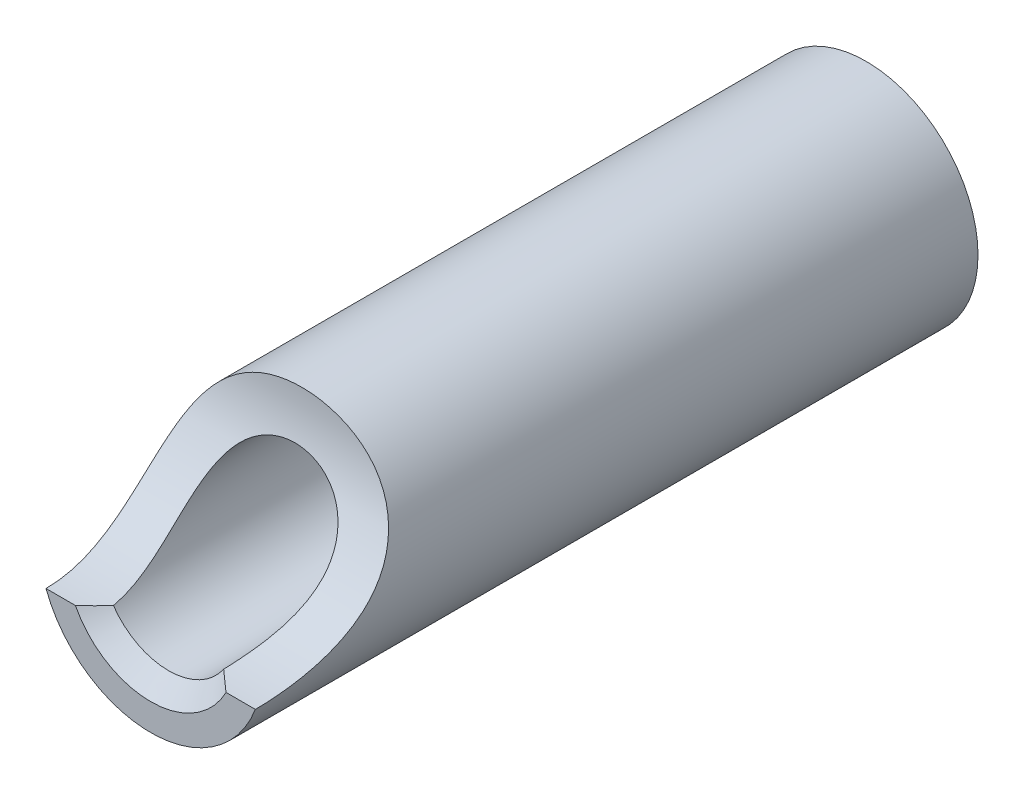
ISO-10303-21;
HEADER;
FILE_DESCRIPTION(('STEP AP214'),'2;1');
FILE_NAME('part.step','',(''),(''),'','','');
FILE_SCHEMA(('AUTOMOTIVE_DESIGN { 1 0 10303 214 1 1 1 1 }'));
ENDSEC;
DATA;
#1=APPLICATION_CONTEXT('core data for automotive mechanical design processes');
#2=APPLICATION_PROTOCOL_DEFINITION('international standard','automotive_design',2000,#1);
#3=PRODUCT_CONTEXT('',#1,'mechanical');
#4=PRODUCT('Part','Part','',(#3));
#5=PRODUCT_RELATED_PRODUCT_CATEGORY('part','',(#4));
#6=PRODUCT_DEFINITION_FORMATION('','',#4);
#7=PRODUCT_DEFINITION_CONTEXT('part definition',#1,'design');
#8=PRODUCT_DEFINITION('design','',#6,#7);
#9=PRODUCT_DEFINITION_SHAPE('','',#8);
#10=(LENGTH_UNIT() NAMED_UNIT(*) SI_UNIT(.MILLI.,.METRE.));
#11=(NAMED_UNIT(*) PLANE_ANGLE_UNIT() SI_UNIT($,.RADIAN.));
#12=(NAMED_UNIT(*) SI_UNIT($,.STERADIAN.) SOLID_ANGLE_UNIT());
#13=UNCERTAINTY_MEASURE_WITH_UNIT(LENGTH_MEASURE(1.E-05),#10,'distance_accuracy_value','');
#14=(GEOMETRIC_REPRESENTATION_CONTEXT(3) GLOBAL_UNCERTAINTY_ASSIGNED_CONTEXT((#13)) GLOBAL_UNIT_ASSIGNED_CONTEXT((#10,
#11,#12)) REPRESENTATION_CONTEXT('',''));
#15=CARTESIAN_POINT('',(0.,0.,0.));
#16=DIRECTION('',(0.,0.,1.));
#17=DIRECTION('',(1.,0.,0.));
#18=AXIS2_PLACEMENT_3D('',#15,#16,#17);
#19=CARTESIAN_POINT('',(0.,0.,50.8));
#20=DIRECTION('',(0.,0.,1.));
#21=DIRECTION('',(1.,0.,0.));
#22=AXIS2_PLACEMENT_3D('',#19,#20,#21);
#23=PLANE('',#22);
#24=DIRECTION('',(1.,0.,0.));
#25=VECTOR('',#24,1.);
#26=CARTESIAN_POINT('',(-7.9375,-2.78989828210711,50.8));
#27=LINE('',#26,#25);
#28=CARTESIAN_POINT('',(-7.43104123427503,-2.78989828210711,50.8));
#29=VERTEX_POINT('',#28);
#30=CARTESIAN_POINT('',(-5.34860017439103,-2.78989828210711,50.8));
#31=VERTEX_POINT('',#30);
#32=EDGE_CURVE('E95',#29,#31,#27,.T.);
#33=ORIENTED_EDGE('',*,*,#32,.F.);
#34=CARTESIAN_POINT('',(0.,0.,50.8));
#35=DIRECTION('',(0.,0.,1.));
#36=DIRECTION('',(1.,0.,0.));
#37=AXIS2_PLACEMENT_3D('',#34,#35,#36);
#38=CIRCLE('',#37,7.9375);
#39=CARTESIAN_POINT('',(7.43104123427503,-2.78989828210711,50.8));
#40=VERTEX_POINT('',#39);
#41=EDGE_CURVE('E89',#29,#40,#38,.T.);
#42=ORIENTED_EDGE('',*,*,#41,.T.);
#43=CARTESIAN_POINT('',(5.34860017439103,-2.78989828210711,50.8));
#44=VERTEX_POINT('',#43);
#45=EDGE_CURVE('E77',#44,#40,#27,.T.);
#46=ORIENTED_EDGE('',*,*,#45,.F.);
#47=CARTESIAN_POINT('',(0.,0.,50.8));
#48=DIRECTION('',(0.,0.,1.));
#49=DIRECTION('',(1.,0.,0.));
#50=AXIS2_PLACEMENT_3D('',#47,#48,#49);
#51=CIRCLE('',#50,6.0325);
#52=EDGE_CURVE('E88',#44,#31,#51,.F.);
#53=ORIENTED_EDGE('',*,*,#52,.T.);
#54=EDGE_LOOP('',(#33,#42,#46,#53));
#55=FACE_BOUND('',#54,.T.);
#56=ADVANCED_FACE('F41',(#55),#23,.T.);
#57=CARTESIAN_POINT('',(0.,0.,0.));
#58=DIRECTION('',(0.,0.,1.));
#59=DIRECTION('',(1.,0.,0.));
#60=AXIS2_PLACEMENT_3D('',#57,#58,#59);
#61=PLANE('',#60);
#62=CARTESIAN_POINT('',(0.,0.,0.));
#63=DIRECTION('',(0.,0.,1.));
#64=DIRECTION('',(1.,0.,0.));
#65=AXIS2_PLACEMENT_3D('',#62,#63,#64);
#66=CIRCLE('',#65,6.03249999999999);
#67=CARTESIAN_POINT('',(6.03249999999999,0.,0.));
#68=VERTEX_POINT('',#67);
#69=EDGE_CURVE('E154',#68,#68,#66,.T.);
#70=ORIENTED_EDGE('',*,*,#69,.T.);
#71=EDGE_LOOP('',(#70));
#72=FACE_BOUND('',#71,.T.);
#73=CARTESIAN_POINT('',(0.,0.,0.));
#74=DIRECTION('',(0.,0.,1.));
#75=DIRECTION('',(1.,0.,0.));
#76=AXIS2_PLACEMENT_3D('',#73,#74,#75);
#77=CIRCLE('',#76,7.9375);
#78=CARTESIAN_POINT('',(7.9375,0.,0.));
#79=VERTEX_POINT('',#78);
#80=EDGE_CURVE('E158',#79,#79,#77,.T.);
#81=ORIENTED_EDGE('',*,*,#80,.F.);
#82=EDGE_LOOP('',(#81));
#83=FACE_BOUND('',#82,.T.);
#84=ADVANCED_FACE('F128',(#72,#83),#61,.F.);
#85=CARTESIAN_POINT('',(0.,0.,50.8));
#86=DIRECTION('',(0.,0.,-1.));
#87=DIRECTION('',(-1.,0.,0.));
#88=AXIS2_PLACEMENT_3D('',#85,#86,#87);
#89=CYLINDRICAL_SURFACE('',#88,7.9375);
#90=ORIENTED_EDGE('',*,*,#41,.F.);
#91=CARTESIAN_POINT('',(-7.43104123427503,-2.78989828210711,50.8));
#92=CARTESIAN_POINT('',(-7.43102382136732,-2.78990287666445,50.6300305804789));
#93=CARTESIAN_POINT('',(-7.43255743304067,-2.78585876748104,50.4600656508634));
#94=CARTESIAN_POINT('',(-7.43859906079418,-2.76970866942878,50.1205840915058));
#95=CARTESIAN_POINT('',(-7.44310686184932,-2.7576032633671,49.9510674302446));
#96=CARTESIAN_POINT('',(-7.45496526672832,-2.72537693640078,49.613010811213));
#97=CARTESIAN_POINT('',(-7.46231395553059,-2.70526141478227,49.4444702729597));
#98=CARTESIAN_POINT('',(-7.47960163144594,-2.65708728652565,49.1086763089797));
#99=CARTESIAN_POINT('',(-7.48954064590534,-2.62902859603045,48.9414228968606));
#100=CARTESIAN_POINT('',(-7.52275189989414,-2.5331339163702,48.4425864015902));
#101=CARTESIAN_POINT('',(-7.54943806174162,-2.45353013550547,48.1134136834843));
#102=CARTESIAN_POINT('',(-7.60848021569662,-2.2637930983823,47.464583373558));
#103=CARTESIAN_POINT('',(-7.64083629896272,-2.15365935125944,47.1449259348169));
#104=CARTESIAN_POINT('',(-7.70233574094531,-1.92102106878398,46.5607278169839));
#105=CARTESIAN_POINT('',(-7.73130869441506,-1.80230290366631,46.2946545453673));
#106=CARTESIAN_POINT('',(-7.78710240029921,-1.54352167511713,45.7728642390489));
#107=CARTESIAN_POINT('',(-7.8139232976753,-1.40346005121877,45.5171465073774));
#108=CARTESIAN_POINT('',(-7.86197518912549,-1.10289819712657,45.0178652563709));
#109=CARTESIAN_POINT('',(-7.88321278062526,-0.942422424901867,44.7742876702836));
#110=CARTESIAN_POINT('',(-7.91650004182506,-0.601824881937868,44.3006127732499));
#111=CARTESIAN_POINT('',(-7.92855177653041,-0.421707537090205,44.0705124433235));
#112=CARTESIAN_POINT('',(-7.93844280788201,-0.084044057264312,43.6736857820491));
#113=CARTESIAN_POINT('',(-7.93879033193087,0.0699700601929678,43.5040087357604));
#114=CARTESIAN_POINT('',(-7.92959105876708,0.388393387492886,43.1750123071314));
#115=CARTESIAN_POINT('',(-7.92004652518047,0.5528002110625,43.0156905640233));
#116=CARTESIAN_POINT('',(-7.88918254279768,0.890772215138729,42.7084726447517));
#117=CARTESIAN_POINT('',(-7.86787031604665,1.06433171944766,42.5605695241686));
#118=CARTESIAN_POINT('',(-7.81166336377182,1.41918364925817,42.2770787619046));
#119=CARTESIAN_POINT('',(-7.7767684837153,1.60047616271895,42.1414912603627));
#120=CARTESIAN_POINT('',(-7.69137320831778,1.97054895184782,41.8823743048738));
#121=CARTESIAN_POINT('',(-7.64073281411452,2.1593825984532,41.7589666599726));
#122=CARTESIAN_POINT('',(-7.52258766260895,2.54054688233775,41.5263918064629));
#123=CARTESIAN_POINT('',(-7.45508285568243,2.73287752990545,41.4172246397589));
#124=CARTESIAN_POINT('',(-7.30232516710918,3.11815088145521,41.2136349154753));
#125=CARTESIAN_POINT('',(-7.2170826963214,3.31109316132285,41.11920376545));
#126=CARTESIAN_POINT('',(-7.0284235603619,3.69470276080392,40.9450465779261));
#127=CARTESIAN_POINT('',(-6.92500944724275,3.88537039586169,40.8653184787273));
#128=CARTESIAN_POINT('',(-6.71620937883633,4.23458896601063,40.7304706130676));
#129=CARTESIAN_POINT('',(-6.61320592477682,4.39384368274212,40.6734630445075));
#130=CARTESIAN_POINT('',(-6.3943568302916,4.7066473026656,40.5693681143987));
#131=CARTESIAN_POINT('',(-6.27851259412107,4.86019682732437,40.5222796697347));
#132=CARTESIAN_POINT('',(-6.03458466691356,5.15994592825254,40.4372517730344));
#133=CARTESIAN_POINT('',(-5.90649959355786,5.30614467156994,40.3993133559901));
#134=CARTESIAN_POINT('',(-5.63889137830772,5.58970647953128,40.3316576211885));
#135=CARTESIAN_POINT('',(-5.49936783446307,5.72706923337377,40.3019405924931));
#136=CARTESIAN_POINT('',(-5.21155080996345,5.9900913555497,40.2500032139038));
#137=CARTESIAN_POINT('',(-5.06338337455723,6.1158718791936,40.2276967834758));
#138=CARTESIAN_POINT('',(-4.7576708045974,6.35659859858504,40.1890294262914));
#139=CARTESIAN_POINT('',(-4.60012174634901,6.47154020848765,40.1726710077992));
#140=CARTESIAN_POINT('',(-4.27669673071728,6.68968005124859,40.1448550946417));
#141=CARTESIAN_POINT('',(-4.11082101241473,6.79287862100354,40.1333974593516));
#142=CARTESIAN_POINT('',(-3.77173904915526,6.98684822231555,40.1143631729308));
#143=CARTESIAN_POINT('',(-3.59853233984044,7.07761846509363,40.1067867680437));
#144=CARTESIAN_POINT('',(-3.23118121890754,7.25314911320936,40.0940615628894));
#145=CARTESIAN_POINT('',(-3.03649126155879,7.33678791981515,40.0891660044906));
#146=CARTESIAN_POINT('',(-2.64100671426011,7.48824637138037,40.0817447095968));
#147=CARTESIAN_POINT('',(-2.44021184398751,7.5560652886854,40.0792190820934));
#148=CARTESIAN_POINT('',(-2.03379159582999,7.67544541188357,40.0756365459336));
#149=CARTESIAN_POINT('',(-1.82816530449564,7.72700351642451,40.0745799173221));
#150=CARTESIAN_POINT('',(-1.41344593813608,7.81351068200985,40.073231036787));
#151=CARTESIAN_POINT('',(-1.20435280924588,7.84845948474122,40.0729387967512));
#152=CARTESIAN_POINT('',(-0.773924495256755,7.90279910859216,40.0726214288197));
#153=CARTESIAN_POINT('',(-0.55248417020049,7.92136086992471,40.0726098230092));
#154=CARTESIAN_POINT('',(-0.108821911205786,7.93985911048411,40.0725980380658));
#155=CARTESIAN_POINT('',(0.113400050017452,7.93979493294639,40.0725978593359));
#156=CARTESIAN_POINT('',(0.557081925983102,7.92103981558556,40.0726102526628));
#157=CARTESIAN_POINT('',(0.778541754002242,7.90234682201283,40.0726228261255));
#158=CARTESIAN_POINT('',(1.21911362131316,7.84646259335156,40.0729517201595));
#159=CARTESIAN_POINT('',(1.43822566935034,7.8092714271926,40.073268039599));
#160=CARTESIAN_POINT('',(1.87366608047325,7.71641694102895,40.0747792047649));
#161=CARTESIAN_POINT('',(2.08997458429771,7.66066051250474,40.0759785163561));
#162=CARTESIAN_POINT('',(2.51711441224049,7.53112529358036,40.0801059368539));
#163=CARTESIAN_POINT('',(2.72794567078238,7.45734628751446,40.0830340664489));
#164=CARTESIAN_POINT('',(3.14263237186589,7.29229568937398,40.0917036258467));
#165=CARTESIAN_POINT('',(3.34648664098042,7.20102117168457,40.097445526421));
#166=CARTESIAN_POINT('',(3.74566174434047,7.00169181846985,40.1130301270691));
#167=CARTESIAN_POINT('',(3.9409826969583,6.89363721580899,40.1228727702384));
#168=CARTESIAN_POINT('',(4.31977867449776,6.66274324086284,40.1479851845992));
#169=CARTESIAN_POINT('',(4.50334850550061,6.54005386370649,40.163202580503));
#170=CARTESIAN_POINT('',(4.85919245243613,6.28018216418937,40.2005851233279));
#171=CARTESIAN_POINT('',(5.03146656754056,6.14299984076593,40.2227502707584));
#172=CARTESIAN_POINT('',(5.36319971911526,5.85560582055087,40.2755468935885));
#173=CARTESIAN_POINT('',(5.5226673083275,5.70540296119538,40.3061726569089));
#174=CARTESIAN_POINT('',(5.82759466033357,5.39356898422031,40.3773780353624));
#175=CARTESIAN_POINT('',(5.97305561285844,5.23193883926645,40.4179568040415));
#176=CARTESIAN_POINT('',(6.23961577527605,4.91037300546002,40.5073070286199));
#177=CARTESIAN_POINT('',(6.3616932561422,4.75104531198242,40.5553501732749));
#178=CARTESIAN_POINT('',(6.59193554411299,4.42605259019641,40.6621474508343));
#179=CARTESIAN_POINT('',(6.70010107495998,4.26038789214064,40.7209010261645));
#180=CARTESIAN_POINT('',(6.90201911734241,3.92483973314183,40.8497281288322));
#181=CARTESIAN_POINT('',(6.99577772128369,3.75495809095937,40.9197968453671));
#182=CARTESIAN_POINT('',(7.16879845948029,3.41305464766019,41.0716165547509));
#183=CARTESIAN_POINT('',(7.24806105230723,3.24103291442775,41.1533671779047));
#184=CARTESIAN_POINT('',(7.38750399675042,2.90843964275421,41.3227583474116));
#185=CARTESIAN_POINT('',(7.44860289189289,2.7478675146072,41.4096455086561));
#186=CARTESIAN_POINT('',(7.5587995738205,2.42837593338201,41.5934487311609));
#187=CARTESIAN_POINT('',(7.60789800040874,2.26945639262911,41.6903642573683));
#188=CARTESIAN_POINT('',(7.6947777365213,1.95472877078506,41.8938979209602));
#189=CARTESIAN_POINT('',(7.73255628093448,1.79892145857967,42.0005184207027));
#190=CARTESIAN_POINT('',(7.7976405784127,1.4917639580717,42.2229651827356));
#191=CARTESIAN_POINT('',(7.82494575352329,1.34041401616661,42.3387919526322));
#192=CARTESIAN_POINT('',(7.87157701811081,1.03338007397375,42.587099485936));
#193=CARTESIAN_POINT('',(7.89025029577197,0.878079143633538,42.7201756793556));
#194=CARTESIAN_POINT('',(7.91811686012925,0.574901539588192,42.9954403401729));
#195=CARTESIAN_POINT('',(7.92730982006122,0.427025121955592,43.1376291214806));
#196=CARTESIAN_POINT('',(7.9375772820049,0.139527823145272,43.4304134417616));
#197=CARTESIAN_POINT('',(7.93865073360163,-9.19875630392625E-05,43.5810100659128));
#198=CARTESIAN_POINT('',(7.93404387610593,-0.270446054395075,43.8899454879953));
#199=CARTESIAN_POINT('',(7.92836121887344,-0.401177204494225,44.0482869593661));
#200=CARTESIAN_POINT('',(7.90989390693172,-0.678613783852588,44.4046577045487));
#201=CARTESIAN_POINT('',(7.89590881020568,-0.823229149697682,44.604254457878));
#202=CARTESIAN_POINT('',(7.86238293051072,-1.09819386979365,45.0126064154519));
#203=CARTESIAN_POINT('',(7.84284134346322,-1.22854115552983,45.2213629415051));
#204=CARTESIAN_POINT('',(7.8003209128347,-1.47462359322823,45.6473701113936));
#205=CARTESIAN_POINT('',(7.77733726839133,-1.59033791313799,45.8646323009673));
#206=CARTESIAN_POINT('',(7.72999114882314,-1.806482712425,46.3064109493798));
#207=CARTESIAN_POINT('',(7.70562897561742,-1.90691652083172,46.5309258151837));
#208=CARTESIAN_POINT('',(7.65259776899222,-2.11065345708935,47.0318880602186));
#209=CARTESIAN_POINT('',(7.62404034515744,-2.21052342782973,47.3097518270733));
#210=CARTESIAN_POINT('',(7.57060495110342,-2.3871258983928,47.8731674362436));
#211=CARTESIAN_POINT('',(7.54572795089281,-2.4638523040371,48.1587212819916));
#212=CARTESIAN_POINT('',(7.50218788803438,-2.59340524256803,48.7350179942113));
#213=CARTESIAN_POINT('',(7.48351150518844,-2.64628309585342,49.0257483052244));
#214=CARTESIAN_POINT('',(7.45416238914075,-2.72787019902771,49.6108448758105));
#215=CARTESIAN_POINT('',(7.44348413111675,-2.75659613389263,49.905208482496));
#216=CARTESIAN_POINT('',(7.43523171009228,-2.77871385296336,50.3001386623243));
#217=CARTESIAN_POINT('',(7.43366173602437,-2.78290939706428,50.4001067663649));
#218=CARTESIAN_POINT('',(7.43156687133923,-2.78850006953762,50.6000460665885));
#219=CARTESIAN_POINT('',(7.43104108242416,-2.78989760500609,50.7000171860604));
#220=CARTESIAN_POINT('',(7.43104123427503,-2.78989828210711,50.8));
#221=B_SPLINE_CURVE_WITH_KNOTS('',3,(#91,#92,#93,#94,#95,#96,#97,#98,#99,#100,#101,#102,#103,
#104,#105,#106,#107,#108,#109,#110,#111,#112,#113,#114,#115,#116,#117,#118,#119,#120,#121,#122,
#123,#124,#125,#126,#127,#128,#129,#130,#131,#132,#133,#134,#135,#136,#137,#138,#139,#140,#141,
#142,#143,#144,#145,#146,#147,#148,#149,#150,#151,#152,#153,#154,#155,#156,#157,#158,#159,#160,
#161,#162,#163,#164,#165,#166,#167,#168,#169,#170,#171,#172,#173,#174,#175,#176,#177,#178,#179,
#180,#181,#182,#183,#184,#185,#186,#187,#188,#189,#190,#191,#192,#193,#194,#195,#196,#197,#198,
#199,#200,#201,#202,#203,#204,#205,#206,#207,#208,#209,#210,#211,#212,#213,#214,#215,#216,#217,
#218,#219,#220),.UNSPECIFIED.,.F.,.F.,(4,2,2,2,2,2,2,2,2,2,2,2,2,2,2,2,2,2,2,2,2,2,2,2,2,2,2,2,
2,2,2,2,2,2,2,2,2,2,2,2,2,2,2,2,2,2,2,2,2,2,2,2,2,2,2,2,2,2,2,2,2,2,2,2,4),(0.,
0.509845414138052,1.01965397201026,1.52911946923528,2.03859034515617,3.0559905843102,
4.07340718229475,4.95085338894839,5.82824044144487,6.704586035469,7.58073456649302,
8.26757405911852,8.95425641511876,9.64051780945825,10.326787011767,11.019341532883,
11.7118980918923,12.4040493058887,13.096103390715,13.6895054213489,14.2828426220308,
14.8762469057443,15.4696720507527,16.0559411240219,16.6424571397929,17.228956324734,
17.8154927153267,18.4506410759057,19.0858186451223,19.7211172857626,20.3564258064415,
21.0222880656987,21.6881738037617,22.3541329610849,23.0200896368693,23.6894378286186,
24.3587940304621,25.0282622604399,25.6977212007498,26.3608287151634,27.0239362781984,
27.6865972419552,28.3492018691991,28.9675460875384,29.5858581246908,30.2039079659695,
30.8219382522709,31.3988627585566,31.9757564994896,32.5527910437724,33.1298574261124,
33.7453708834771,34.3609055554281,34.9765198572967,35.5923481834397,36.3322810443941,
37.0723210354248,37.8134029908712,38.5543232614619,39.4432222363125,40.3323550726886,
41.2195653204806,42.1061621481226,42.4063344655777,42.7062484369379),.UNSPECIFIED.);
#222=EDGE_CURVE('E66',#29,#40,#221,.T.);
#223=ORIENTED_EDGE('',*,*,#222,.T.);
#224=EDGE_LOOP('',(#90,#223));
#225=FACE_BOUND('',#224,.T.);
#226=ORIENTED_EDGE('',*,*,#80,.T.);
#227=EDGE_LOOP('',(#226));
#228=FACE_BOUND('',#227,.T.);
#229=ADVANCED_FACE('F127',(#225,#228),#89,.T.);
#230=CARTESIAN_POINT('',(0.,0.,50.8));
#231=DIRECTION('',(0.,0.,-1.));
#232=DIRECTION('',(-1.,0.,0.));
#233=AXIS2_PLACEMENT_3D('',#230,#231,#232);
#234=CYLINDRICAL_SURFACE('',#233,4.7625);
#235=CARTESIAN_POINT('',(-3.91319984407248,-2.71445634158133,49.53));
#236=CARTESIAN_POINT('',(-3.92477474195459,-2.69775519508808,49.3899162085328));
#237=CARTESIAN_POINT('',(-3.93811611844276,-2.67830965194911,49.2503326703605));
#238=CARTESIAN_POINT('',(-3.96789072660615,-2.63400441673134,48.972387630169));
#239=CARTESIAN_POINT('',(-3.98432332276705,-2.60914583733676,48.8340258830759));
#240=CARTESIAN_POINT('',(-4.03756313443191,-2.52661522842537,48.4213432830804));
#241=CARTESIAN_POINT('',(-4.07834166340507,-2.46094870362557,48.1490947210658));
#242=CARTESIAN_POINT('',(-4.16675323114825,-2.30812202232267,47.6087610603299));
#243=CARTESIAN_POINT('',(-4.21445364003718,-2.22074377921141,47.3407495182108));
#244=CARTESIAN_POINT('',(-4.31178303705702,-2.02530298558978,46.8126557766273));
#245=CARTESIAN_POINT('',(-4.36141255450945,-1.91723472562796,46.5525757889109));
#246=CARTESIAN_POINT('',(-4.45953684002279,-1.67671799519169,46.0325327264907));
#247=CARTESIAN_POINT('',(-4.50793483451605,-1.5435624358726,45.772877519965));
#248=CARTESIAN_POINT('',(-4.59641924167773,-1.25578782333059,45.2641239475283));
#249=CARTESIAN_POINT('',(-4.63650408449052,-1.10116472536433,45.0150275826022));
#250=CARTESIAN_POINT('',(-4.7024895504514,-0.772020724570098,44.530503870173));
#251=CARTESIAN_POINT('',(-4.7284744536202,-0.597625756111042,44.2950029950161));
#252=CARTESIAN_POINT('',(-4.76055398171783,-0.229395675322941,43.8383427760397));
#253=CARTESIAN_POINT('',(-4.76666791149317,-0.0355796196375981,43.617169717516));
#254=CARTESIAN_POINT('',(-4.75568641732243,0.277890105398365,43.2877745253676));
#255=CARTESIAN_POINT('',(-4.74780461695139,0.391626668609118,43.1735484637219));
#256=CARTESIAN_POINT('',(-4.7229374401565,0.623592466895284,42.95081880947));
#257=CARTESIAN_POINT('',(-4.70595520818974,0.741820137063701,42.842313254482));
#258=CARTESIAN_POINT('',(-4.66176323997821,0.981976856696082,42.6315666575633));
#259=CARTESIAN_POINT('',(-4.63455069667544,1.10390691359609,42.5293273439667));
#260=CARTESIAN_POINT('',(-4.56883652988234,1.3503319825667,42.3317519320097));
#261=CARTESIAN_POINT('',(-4.5303345628083,1.4748270725946,42.2364160438592));
#262=CARTESIAN_POINT('',(-4.44064152800393,1.72630004516187,42.0522800095183));
#263=CARTESIAN_POINT('',(-4.38932133317566,1.85329026991172,41.9635590974261));
#264=CARTESIAN_POINT('',(-4.27346248017366,2.10673518511485,41.7943088213265));
#265=CARTESIAN_POINT('',(-4.20892365357021,2.2331898687234,41.7137795617154));
#266=CARTESIAN_POINT('',(-4.06626123484679,2.48347633544905,41.5613771232087));
#267=CARTESIAN_POINT('',(-3.98814900167767,2.60731021535468,41.4894967908847));
#268=CARTESIAN_POINT('',(-3.81826028399642,2.85030822784817,41.3545319701076));
#269=CARTESIAN_POINT('',(-3.72648632218529,2.96947321744722,41.2914458619166));
#270=CARTESIAN_POINT('',(-3.54380919040815,3.18429808588268,41.1824894568519));
#271=CARTESIAN_POINT('',(-3.4546766377466,3.28087465679276,41.1354479796949));
#272=CARTESIAN_POINT('',(-3.26713795633864,3.46766841297736,41.0476501170323));
#273=CARTESIAN_POINT('',(-3.16873272178008,3.55788620998068,41.0068931264952));
#274=CARTESIAN_POINT('',(-2.96332225570445,3.73070259394992,40.93142234796));
#275=CARTESIAN_POINT('',(-2.85631836304389,3.8133023627981,40.8967076218042));
#276=CARTESIAN_POINT('',(-2.63451794640045,3.96977810852889,40.8329845306473));
#277=CARTESIAN_POINT('',(-2.51972175212318,4.04365445415255,40.8039759244127));
#278=CARTESIAN_POINT('',(-2.29371336655106,4.17562846786185,40.7536107076613));
#279=CARTESIAN_POINT('',(-2.18307653917938,4.23454285651943,40.731805092822));
#280=CARTESIAN_POINT('',(-1.95685809936797,4.34371840023418,40.6923207172322));
#281=CARTESIAN_POINT('',(-1.84127492879149,4.39397680316244,40.6746432683789));
#282=CARTESIAN_POINT('',(-1.60608546971214,4.48528731532908,40.6431483919929));
#283=CARTESIAN_POINT('',(-1.48648113829372,4.52634383058556,40.6293291163201));
#284=CARTESIAN_POINT('',(-1.24400728188263,4.59889906972001,40.6052817464593));
#285=CARTESIAN_POINT('',(-1.1211365590192,4.63039423311215,40.5950549898423));
#286=CARTESIAN_POINT('',(-0.873366670874833,4.6834439643601,40.5780154461313));
#287=CARTESIAN_POINT('',(-0.748473502941439,4.70502377111882,40.5711939871962));
#288=CARTESIAN_POINT('',(-0.497186197713734,4.738172558113,40.5607773545571));
#289=CARTESIAN_POINT('',(-0.370791526925702,4.74973786531246,40.5571833645798));
#290=CARTESIAN_POINT('',(-0.11747121836675,4.7627394404709,40.553146051617));
#291=CARTESIAN_POINT('',(0.00945424492675905,4.76417880960195,40.5527017640025));
#292=CARTESIAN_POINT('',(0.263034210030704,4.75692275713666,40.5549516082186));
#293=CARTESIAN_POINT('',(0.389688594166705,4.74822358428764,40.5576469016915));
#294=CARTESIAN_POINT('',(0.64270578135575,4.72066165579764,40.5662697495959));
#295=CARTESIAN_POINT('',(0.76905983539328,4.70172577629517,40.5722205628881));
#296=CARTESIAN_POINT('',(1.01968978402765,4.65380733524417,40.5875043141291));
#297=CARTESIAN_POINT('',(1.14396488858501,4.62482104135771,40.5968385085944));
#298=CARTESIAN_POINT('',(1.38944469596862,4.55708839408115,40.6190786232835));
#299=CARTESIAN_POINT('',(1.51065063821459,4.51834605195284,40.6319830757875));
#300=CARTESIAN_POINT('',(1.74921213992428,4.43145392734487,40.6616164483462));
#301=CARTESIAN_POINT('',(1.86656627797814,4.38330071661459,40.6783467624888));
#302=CARTESIAN_POINT('',(2.09607498661402,4.27828686634574,40.715837812748));
#303=CARTESIAN_POINT('',(2.20824814603751,4.22146112077661,40.7365824829488));
#304=CARTESIAN_POINT('',(2.42708311212328,4.09955619245618,40.7824404196852));
#305=CARTESIAN_POINT('',(2.53374488012158,4.03447695181531,40.8075537168624));
#306=CARTESIAN_POINT('',(2.74078936855524,3.89678483057353,40.8624357777758));
#307=CARTESIAN_POINT('',(2.84117349912627,3.82417365167373,40.892203490701));
#308=CARTESIAN_POINT('',(3.03502610801124,3.67221902595228,40.9566640113774));
#309=CARTESIAN_POINT('',(3.12849448142468,3.59287547705096,40.9913568938119));
#310=CARTESIAN_POINT('',(3.30725124884191,3.42900482162599,41.0655991296977));
#311=CARTESIAN_POINT('',(3.3925980666363,3.34452326732398,41.1051082455574));
#312=CARTESIAN_POINT('',(3.55552291042352,3.17078485337193,41.1893365031945));
#313=CARTESIAN_POINT('',(3.63309831507107,3.0815263979153,41.2340573920046));
#314=CARTESIAN_POINT('',(3.8536102940412,2.80815396426213,41.3761558303912));
#315=CARTESIAN_POINT('',(3.98450983888547,2.61827787413094,41.4815416990904));
#316=CARTESIAN_POINT('',(4.21677141561063,2.22575636957439,41.7166610734099));
#317=CARTESIAN_POINT('',(4.31709677854445,2.02289770693877,41.8470458118535));
#318=CARTESIAN_POINT('',(4.48469517504473,1.61771810108968,42.1283084033941));
#319=CARTESIAN_POINT('',(4.55195275573634,1.41539745313494,42.2791957956097));
#320=CARTESIAN_POINT('',(4.64201541831934,1.07457990184289,42.5531372253435));
#321=CARTESIAN_POINT('',(4.67203120250179,0.934367085624284,42.6718223982537));
#322=CARTESIAN_POINT('',(4.71875416701341,0.658986341459365,42.9174666007618));
#323=CARTESIAN_POINT('',(4.73545665049312,0.523820209967337,43.0444285332755));
#324=CARTESIAN_POINT('',(4.75727002069524,0.259611617737427,43.3058873428067));
#325=CARTESIAN_POINT('',(4.7623616443306,0.130579680656124,43.4403963627131));
#326=CARTESIAN_POINT('',(4.76263282626502,-0.120316179798814,43.7159741959945));
#327=CARTESIAN_POINT('',(4.75780937183347,-0.242177912908211,43.8570449904574));
#328=CARTESIAN_POINT('',(4.73601834101968,-0.5295218837044,44.2077332116234));
#329=CARTESIAN_POINT('',(4.71467791256945,-0.690897144110019,44.4204546637501));
#330=CARTESIAN_POINT('',(4.6596304006388,-0.996695421558549,44.856248778224));
#331=CARTESIAN_POINT('',(4.62591761128367,-1.14111057632705,45.0793261749878));
#332=CARTESIAN_POINT('',(4.55034114239115,-1.41269057443243,45.534883732701));
#333=CARTESIAN_POINT('',(4.50846420074745,-1.53982677119858,45.7673786983629));
#334=CARTESIAN_POINT('',(4.42064723123003,-1.7762845120362,46.2404607877242));
#335=CARTESIAN_POINT('',(4.37470765133628,-1.88560801651246,46.4810470174057));
#336=CARTESIAN_POINT('',(4.28659669130918,-2.07766343611547,46.9487762287869));
#337=CARTESIAN_POINT('',(4.24443767394364,-2.1618672456609,47.1753185835593));
#338=CARTESIAN_POINT('',(4.16294802691743,-2.31490510515341,47.6339776387677));
#339=CARTESIAN_POINT('',(4.12361667656306,-2.38374308090624,47.8660928985626));
#340=CARTESIAN_POINT('',(4.05077716097327,-2.50552172713468,48.3344993988888));
#341=CARTESIAN_POINT('',(4.01724869177881,-2.55851831941672,48.5707727555543));
#342=CARTESIAN_POINT('',(3.97316256172253,-2.62604357491946,48.92827532529));
#343=CARTESIAN_POINT('',(3.95949654250705,-2.64656403201286,49.0480165391697));
#344=CARTESIAN_POINT('',(3.93451537156721,-2.68355800224717,49.2883819035924));
#345=CARTESIAN_POINT('',(3.92320053684175,-2.70003096973907,49.4090061709266));
#346=CARTESIAN_POINT('',(3.91319984407248,-2.71445634158133,49.53));
#347=B_SPLINE_CURVE_WITH_KNOTS('',3,(#235,#236,#237,#238,#239,#240,#241,#242,#243,#244,#245,
#246,#247,#248,#249,#250,#251,#252,#253,#254,#255,#256,#257,#258,#259,#260,#261,#262,#263,#264,
#265,#266,#267,#268,#269,#270,#271,#272,#273,#274,#275,#276,#277,#278,#279,#280,#281,#282,#283,
#284,#285,#286,#287,#288,#289,#290,#291,#292,#293,#294,#295,#296,#297,#298,#299,#300,#301,#302,
#303,#304,#305,#306,#307,#308,#309,#310,#311,#312,#313,#314,#315,#316,#317,#318,#319,#320,#321,
#322,#323,#324,#325,#326,#327,#328,#329,#330,#331,#332,#333,#334,#335,#336,#337,#338,#339,#340,
#341,#342,#343,#344,#345,#346),.UNSPECIFIED.,.F.,.F.,(4,2,2,2,2,2,2,2,2,2,2,2,2,2,2,2,2,2,2,2,2,
2,2,2,2,2,2,2,2,2,2,2,2,2,2,2,2,2,2,2,2,2,2,2,2,2,2,2,2,2,2,2,2,2,2,4),(0.,0.424564240304045,
0.84904129095722,1.69699690724355,2.5538410174625,3.41092191722119,4.29729917446163,
5.18384366308397,6.06502891299414,6.94535782644979,7.42916653420801,7.91280818003029,
8.39658262750021,8.88037179974985,9.36924631217379,9.85812705414771,10.3466006277884,
10.834984114168,11.2531745203227,11.6713246405226,12.0894097782272,12.5074772370481,
12.8887101571552,13.2700640655615,13.6512349833619,14.0325476691495,14.412884296423,
14.7933603614298,15.1737198966764,15.554220209347,15.9374751741474,16.3208726178312,
16.7041126818456,17.087492616075,17.4693688187082,17.8512476999489,18.2330404899209,
18.614839069867,18.9936421969986,19.372572669547,20.1296844920413,20.9101704555291,
21.6910208013473,22.2487187200209,22.8066133040664,23.3654327961455,23.9244221125508,
24.7267741880021,25.5294967574407,26.333534326327,27.1374833456938,27.8729485566513,
28.6082256485148,29.3408756171444,29.7075530762774,30.0742799407378),.UNSPECIFIED.);
#348=CARTESIAN_POINT('',(-3.91319984407248,-2.71445634158133,49.53));
#349=VERTEX_POINT('',#348);
#350=CARTESIAN_POINT('',(3.91319984407248,-2.71445634158133,49.53));
#351=VERTEX_POINT('',#350);
#352=EDGE_CURVE('E61',#349,#351,#347,.T.);
#353=ORIENTED_EDGE('',*,*,#352,.F.);
#354=CARTESIAN_POINT('',(0.,0.,49.53));
#355=DIRECTION('',(0.,0.,1.));
#356=DIRECTION('',(1.,0.,0.));
#357=AXIS2_PLACEMENT_3D('',#354,#355,#356);
#358=CIRCLE('',#357,4.7625);
#359=EDGE_CURVE('E100',#349,#351,#358,.T.);
#360=ORIENTED_EDGE('',*,*,#359,.T.);
#361=EDGE_LOOP('',(#353,#360));
#362=FACE_BOUND('',#361,.T.);
#363=CARTESIAN_POINT('',(0.,0.,1.26999999999999));
#364=DIRECTION('',(0.,0.,1.));
#365=DIRECTION('',(1.,0.,0.));
#366=AXIS2_PLACEMENT_3D('',#363,#364,#365);
#367=CIRCLE('',#366,4.7625);
#368=CARTESIAN_POINT('',(4.7625,0.,1.26999999999999));
#369=VERTEX_POINT('',#368);
#370=EDGE_CURVE('E94',#369,#369,#367,.F.);
#371=ORIENTED_EDGE('',*,*,#370,.T.);
#372=EDGE_LOOP('',(#371));
#373=FACE_BOUND('',#372,.T.);
#374=ADVANCED_FACE('F110',(#362,#373),#234,.F.);
#375=CARTESIAN_POINT('',(0.,0.,0.));
#376=DIRECTION('',(0.,0.,-1.));
#377=DIRECTION('',(-1.,0.,0.));
#378=AXIS2_PLACEMENT_3D('',#375,#376,#377);
#379=CONICAL_SURFACE('',#378,6.03249999999999,0.785398163397447);
#380=ORIENTED_EDGE('',*,*,#370,.F.);
#381=EDGE_LOOP('',(#380));
#382=FACE_BOUND('',#381,.T.);
#383=ORIENTED_EDGE('',*,*,#69,.F.);
#384=EDGE_LOOP('',(#383));
#385=FACE_BOUND('',#384,.T.);
#386=ADVANCED_FACE('F135',(#382,#385),#379,.F.);
#387=CARTESIAN_POINT('',(0.,0.,49.53));
#388=DIRECTION('',(0.,0.,1.));
#389=DIRECTION('',(1.,0.,0.));
#390=AXIS2_PLACEMENT_3D('',#387,#388,#389);
#391=CONICAL_SURFACE('',#390,4.7625,0.785398163397449);
#392=CARTESIAN_POINT('',(-7.30371110838529,-2.64840765672247,52.5365577981453));
#393=CARTESIAN_POINT('',(-7.15346781026625,-2.67034823006727,52.4027949804522));
#394=CARTESIAN_POINT('',(-7.00297241585412,-2.68971051449162,52.2689085101564));
#395=CARTESIAN_POINT('',(-6.70158499815848,-2.72331899958649,52.0009407403094));
#396=CARTESIAN_POINT('',(-6.55069297625054,-2.7375652179768,51.8668594414347));
#397=CARTESIAN_POINT('',(-6.09755248795734,-2.77269298415354,51.4643746334893));
#398=CARTESIAN_POINT('',(-5.79486874805465,-2.78595940788114,51.1957561479618));
#399=CARTESIAN_POINT('',(-5.20480182232298,-2.79216501333083,50.6724580353146));
#400=CARTESIAN_POINT('',(-4.9174324790995,-2.78611470008987,50.4177721600079));
#401=CARTESIAN_POINT('',(-4.34294780666886,-2.75588560023192,49.9092809537352));
#402=CARTESIAN_POINT('',(-4.05583243432676,-2.73171097063812,49.6554754342579));
#403=CARTESIAN_POINT('',(-3.66499296593018,-2.68651224064604,49.311395108337));
#404=CARTESIAN_POINT('',(-3.56117990885873,-2.67332521511783,49.2201381016413));
#405=CARTESIAN_POINT('',(-3.35112619706305,-2.64427618437237,49.0359202287486));
#406=CARTESIAN_POINT('',(-3.2448848458967,-2.62835943660925,48.9429686835392));
#407=CARTESIAN_POINT('',(-3.03229214870648,-2.59410498460294,48.7576351304184));
#408=CARTESIAN_POINT('',(-2.92594080000817,-2.57576722005471,48.6652531367538));
#409=CARTESIAN_POINT('',(-2.71295720468598,-2.53671653985694,48.4812290369184));
#410=CARTESIAN_POINT('',(-2.6063248622443,-2.51600267134967,48.3895872434601));
#411=CARTESIAN_POINT('',(-2.39255421823253,-2.47232790964599,48.2074403721786));
#412=CARTESIAN_POINT('',(-2.28541592498358,-2.44936705328313,48.1169352757495));
#413=CARTESIAN_POINT('',(-2.17788905716944,-2.42534344858579,48.0271766080298));
#414=B_SPLINE_CURVE_WITH_KNOTS('',3,(#392,#393,#394,#395,#396,#397,#398,#399,#400,#401,#402,
#403,#404,#405,#406,#407,#408,#409,#410,#411,#412,#413),.UNSPECIFIED.,.F.,.F.,(4,2,2,2,2,2,2,2,
2,2,4),(0.,0.607023293699481,1.2140444849191,2.4282044698089,3.5799096247298,4.73135070343219,
5.14788247813461,5.57403356478702,6.00019526842805,6.42652847150632,6.85285468712682),.UNSPECIFIED.);
#415=EDGE_CURVE('E11',#31,#349,#414,.T.);
#416=ORIENTED_EDGE('',*,*,#415,.F.);
#417=ORIENTED_EDGE('',*,*,#52,.F.);
#418=CARTESIAN_POINT('',(2.17788905716944,-2.42534344858579,48.0271766080298));
#419=CARTESIAN_POINT('',(2.28541592498362,-2.44936705328312,48.1169352757495));
#420=CARTESIAN_POINT('',(2.39255421823256,-2.47232790964599,48.2074403721785));
#421=CARTESIAN_POINT('',(2.60632486224429,-2.51600267134967,48.3895872434601));
#422=CARTESIAN_POINT('',(2.71295720468594,-2.53671653985694,48.4812290369184));
#423=CARTESIAN_POINT('',(2.92594080000821,-2.5757672200547,48.6652531367538));
#424=CARTESIAN_POINT('',(3.03229214870662,-2.59410498460292,48.7576351304182));
#425=CARTESIAN_POINT('',(3.24488484589657,-2.62835943660928,48.9429686835394));
#426=CARTESIAN_POINT('',(3.35112619706256,-2.64427618437246,49.0359202287491));
#427=CARTESIAN_POINT('',(3.56117990885822,-2.67332521511792,49.2201381016419));
#428=CARTESIAN_POINT('',(3.66499296592999,-2.68651224064608,49.3113951083372));
#429=CARTESIAN_POINT('',(4.05583243432733,-2.73171097063802,49.6554754342573));
#430=CARTESIAN_POINT('',(4.34294780666902,-2.75588560023189,49.9092809537351));
#431=CARTESIAN_POINT('',(4.91743247909936,-2.7861147000899,50.4177721600081));
#432=CARTESIAN_POINT('',(5.20480182232294,-2.79216501333084,50.6724580353146));
#433=CARTESIAN_POINT('',(5.79486874805468,-2.78595940788113,51.1957561479617));
#434=CARTESIAN_POINT('',(6.09755248795734,-2.77269298415354,51.4643746334893));
#435=CARTESIAN_POINT('',(6.55069297625052,-2.7375652179768,51.8668594414347));
#436=CARTESIAN_POINT('',(6.70158499815847,-2.72331899958649,52.0009407403094));
#437=CARTESIAN_POINT('',(7.00297241585411,-2.68971051449162,52.2689085101564));
#438=CARTESIAN_POINT('',(7.15346781026625,-2.67034823006727,52.4027949804522));
#439=CARTESIAN_POINT('',(7.30371110838529,-2.64840765672247,52.5365577981453));
#440=B_SPLINE_CURVE_WITH_KNOTS('',3,(#418,#419,#420,#421,#422,#423,#424,#425,#426,#427,#428,
#429,#430,#431,#432,#433,#434,#435,#436,#437,#438,#439),.UNSPECIFIED.,.F.,.F.,(4,2,2,2,2,2,2,2,
2,2,4),(0.,0.426326215620513,0.852659418698774,1.27882112233981,1.70497220899222,
2.12150398369465,3.27294506239704,4.42465021731792,5.6388102022077,6.24583139342733,
6.85285468712682),.UNSPECIFIED.);
#441=EDGE_CURVE('E57',#351,#44,#440,.T.);
#442=ORIENTED_EDGE('',*,*,#441,.F.);
#443=ORIENTED_EDGE('',*,*,#359,.F.);
#444=EDGE_LOOP('',(#416,#417,#442,#443));
#445=FACE_BOUND('',#444,.T.);
#446=ADVANCED_FACE('F42',(#445),#391,.F.);
#447=CARTESIAN_POINT('',(-7.9375,7.9375,50.8));
#448=DIRECTION('',(1.,0.,0.));
#449=DIRECTION('',(0.,0.,-1.));
#450=AXIS2_PLACEMENT_3D('',#447,#448,#449);
#451=CYLINDRICAL_SURFACE('',#450,10.7273982821071);
#452=ORIENTED_EDGE('',*,*,#32,.T.);
#453=ORIENTED_EDGE('',*,*,#415,.T.);
#454=ORIENTED_EDGE('',*,*,#352,.T.);
#455=ORIENTED_EDGE('',*,*,#441,.T.);
#456=ORIENTED_EDGE('',*,*,#45,.T.);
#457=ORIENTED_EDGE('',*,*,#222,.F.);
#458=EDGE_LOOP('',(#452,#453,#454,#455,#456,#457));
#459=FACE_BOUND('',#458,.T.);
#460=ADVANCED_FACE('F78',(#459),#451,.F.);
#461=CLOSED_SHELL('',(#56,#84,#229,#374,#386,#446,#460));
#462=MANIFOLD_SOLID_BREP('B2',#461);
#463=ADVANCED_BREP_SHAPE_REPRESENTATION('',(#18,#462),#14);
#464=SHAPE_DEFINITION_REPRESENTATION(#9,#463);
ENDSEC;
END-ISO-10303-21;
